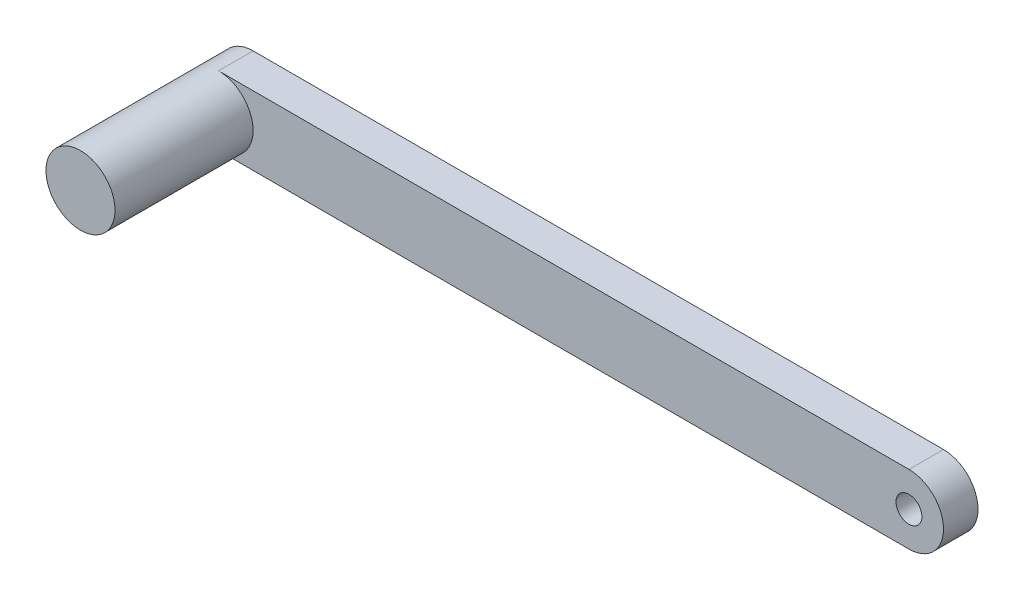
ISO-10303-21;
HEADER;
FILE_DESCRIPTION(('STEP AP214'),'2;1');
FILE_NAME('part.step','',(''),(''),'','','');
FILE_SCHEMA(('AUTOMOTIVE_DESIGN { 1 0 10303 214 1 1 1 1 }'));
ENDSEC;
DATA;
#1=APPLICATION_CONTEXT('core data for automotive mechanical design processes');
#2=APPLICATION_PROTOCOL_DEFINITION('international standard','automotive_design',2000,#1);
#3=PRODUCT_CONTEXT('',#1,'mechanical');
#4=PRODUCT('Part','Part','',(#3));
#5=PRODUCT_RELATED_PRODUCT_CATEGORY('part','',(#4));
#6=PRODUCT_DEFINITION_FORMATION('','',#4);
#7=PRODUCT_DEFINITION_CONTEXT('part definition',#1,'design');
#8=PRODUCT_DEFINITION('design','',#6,#7);
#9=PRODUCT_DEFINITION_SHAPE('','',#8);
#10=(LENGTH_UNIT() NAMED_UNIT(*) SI_UNIT(.MILLI.,.METRE.));
#11=(NAMED_UNIT(*) PLANE_ANGLE_UNIT() SI_UNIT($,.RADIAN.));
#12=(NAMED_UNIT(*) SI_UNIT($,.STERADIAN.) SOLID_ANGLE_UNIT());
#13=UNCERTAINTY_MEASURE_WITH_UNIT(LENGTH_MEASURE(1.E-05),#10,'distance_accuracy_value','');
#14=(GEOMETRIC_REPRESENTATION_CONTEXT(3) GLOBAL_UNCERTAINTY_ASSIGNED_CONTEXT((#13)) GLOBAL_UNIT_ASSIGNED_CONTEXT((#10,
#11,#12)) REPRESENTATION_CONTEXT('',''));
#15=CARTESIAN_POINT('',(0.,0.,0.));
#16=DIRECTION('',(0.,0.,1.));
#17=DIRECTION('',(1.,0.,0.));
#18=AXIS2_PLACEMENT_3D('',#15,#16,#17);
#19=CARTESIAN_POINT('',(0.,0.,2.));
#20=DIRECTION('',(0.,0.,-1.));
#21=DIRECTION('',(-1.,0.,0.));
#22=AXIS2_PLACEMENT_3D('',#19,#20,#21);
#23=CYLINDRICAL_SURFACE('',#22,2.);
#24=CARTESIAN_POINT('',(0.,0.,0.));
#25=DIRECTION('',(0.,0.,1.));
#26=DIRECTION('',(1.,0.,0.));
#27=AXIS2_PLACEMENT_3D('',#24,#25,#26);
#28=CIRCLE('',#27,2.);
#29=CARTESIAN_POINT('',(0.,2.,0.));
#30=VERTEX_POINT('',#29);
#31=CARTESIAN_POINT('',(0.,-2.,0.));
#32=VERTEX_POINT('',#31);
#33=EDGE_CURVE('E108',#30,#32,#28,.T.);
#34=ORIENTED_EDGE('',*,*,#33,.T.);
#35=DIRECTION('',(0.,0.,-1.));
#36=VECTOR('',#35,1.);
#37=CARTESIAN_POINT('',(0.,-2.,2.));
#38=LINE('',#37,#36);
#39=CARTESIAN_POINT('',(0.,-2.,2.));
#40=VERTEX_POINT('',#39);
#41=EDGE_CURVE('E55',#40,#32,#38,.T.);
#42=ORIENTED_EDGE('',*,*,#41,.F.);
#43=CARTESIAN_POINT('',(0.,0.,2.));
#44=DIRECTION('',(0.,0.,1.));
#45=DIRECTION('',(1.,0.,0.));
#46=AXIS2_PLACEMENT_3D('',#43,#44,#45);
#47=CIRCLE('',#46,2.);
#48=CARTESIAN_POINT('',(0.,2.,2.));
#49=VERTEX_POINT('',#48);
#50=EDGE_CURVE('E11',#40,#49,#47,.T.);
#51=ORIENTED_EDGE('',*,*,#50,.T.);
#52=DIRECTION('',(0.,0.,-1.));
#53=VECTOR('',#52,1.);
#54=CARTESIAN_POINT('',(0.,2.,2.));
#55=LINE('',#54,#53);
#56=EDGE_CURVE('E93',#49,#30,#55,.T.);
#57=ORIENTED_EDGE('',*,*,#56,.T.);
#58=EDGE_LOOP('',(#34,#42,#51,#57));
#59=FACE_BOUND('',#58,.T.);
#60=CARTESIAN_POINT('',(0.,0.,10.));
#61=DIRECTION('',(0.,0.,1.));
#62=DIRECTION('',(1.,0.,0.));
#63=AXIS2_PLACEMENT_3D('',#60,#61,#62);
#64=CIRCLE('',#63,2.);
#65=CARTESIAN_POINT('',(2.,0.,10.));
#66=VERTEX_POINT('',#65);
#67=EDGE_CURVE('E126',#66,#66,#64,.T.);
#68=ORIENTED_EDGE('',*,*,#67,.F.);
#69=EDGE_LOOP('',(#68));
#70=FACE_BOUND('',#69,.T.);
#71=ADVANCED_FACE('F45',(#59,#70),#23,.T.);
#72=CARTESIAN_POINT('',(0.,-2.,2.));
#73=DIRECTION('',(0.,1.,0.));
#74=DIRECTION('',(0.,0.,1.));
#75=AXIS2_PLACEMENT_3D('',#72,#73,#74);
#76=PLANE('',#75);
#77=DIRECTION('',(1.,0.,0.));
#78=VECTOR('',#77,1.);
#79=CARTESIAN_POINT('',(0.,-2.,0.));
#80=LINE('',#79,#78);
#81=CARTESIAN_POINT('',(40.,-2.,0.));
#82=VERTEX_POINT('',#81);
#83=EDGE_CURVE('E122',#32,#82,#80,.T.);
#84=ORIENTED_EDGE('',*,*,#83,.T.);
#85=DIRECTION('',(0.,0.,-1.));
#86=VECTOR('',#85,1.);
#87=CARTESIAN_POINT('',(40.,-2.,2.));
#88=LINE('',#87,#86);
#89=CARTESIAN_POINT('',(40.,-2.,2.));
#90=VERTEX_POINT('',#89);
#91=EDGE_CURVE('E111',#90,#82,#88,.T.);
#92=ORIENTED_EDGE('',*,*,#91,.F.);
#93=DIRECTION('',(1.,0.,0.));
#94=VECTOR('',#93,1.);
#95=CARTESIAN_POINT('',(0.,-2.,2.));
#96=LINE('',#95,#94);
#97=EDGE_CURVE('E119',#40,#90,#96,.T.);
#98=ORIENTED_EDGE('',*,*,#97,.F.);
#99=ORIENTED_EDGE('',*,*,#41,.T.);
#100=EDGE_LOOP('',(#84,#92,#98,#99));
#101=FACE_BOUND('',#100,.T.);
#102=ADVANCED_FACE('F158',(#101),#76,.F.);
#103=CARTESIAN_POINT('',(40.,0.,2.));
#104=DIRECTION('',(0.,0.,-1.));
#105=DIRECTION('',(-1.,0.,0.));
#106=AXIS2_PLACEMENT_3D('',#103,#104,#105);
#107=CYLINDRICAL_SURFACE('',#106,2.);
#108=CARTESIAN_POINT('',(40.,0.,0.));
#109=DIRECTION('',(0.,0.,1.));
#110=DIRECTION('',(1.,0.,0.));
#111=AXIS2_PLACEMENT_3D('',#108,#109,#110);
#112=CIRCLE('',#111,2.);
#113=CARTESIAN_POINT('',(40.,2.,0.));
#114=VERTEX_POINT('',#113);
#115=EDGE_CURVE('E81',#82,#114,#112,.T.);
#116=ORIENTED_EDGE('',*,*,#115,.T.);
#117=DIRECTION('',(0.,0.,-1.));
#118=VECTOR('',#117,1.);
#119=CARTESIAN_POINT('',(40.,2.,2.));
#120=LINE('',#119,#118);
#121=CARTESIAN_POINT('',(40.,2.,2.));
#122=VERTEX_POINT('',#121);
#123=EDGE_CURVE('E100',#122,#114,#120,.T.);
#124=ORIENTED_EDGE('',*,*,#123,.F.);
#125=CARTESIAN_POINT('',(40.,0.,2.));
#126=DIRECTION('',(0.,0.,1.));
#127=DIRECTION('',(1.,0.,0.));
#128=AXIS2_PLACEMENT_3D('',#125,#126,#127);
#129=CIRCLE('',#128,2.);
#130=EDGE_CURVE('E64',#90,#122,#129,.T.);
#131=ORIENTED_EDGE('',*,*,#130,.F.);
#132=ORIENTED_EDGE('',*,*,#91,.T.);
#133=EDGE_LOOP('',(#116,#124,#131,#132));
#134=FACE_BOUND('',#133,.T.);
#135=ADVANCED_FACE('F163',(#134),#107,.T.);
#136=CARTESIAN_POINT('',(0.,2.,2.));
#137=DIRECTION('',(0.,-1.,0.));
#138=DIRECTION('',(0.,0.,-1.));
#139=AXIS2_PLACEMENT_3D('',#136,#137,#138);
#140=PLANE('',#139);
#141=DIRECTION('',(-1.,0.,0.));
#142=VECTOR('',#141,1.);
#143=CARTESIAN_POINT('',(0.,2.,0.));
#144=LINE('',#143,#142);
#145=EDGE_CURVE('E87',#114,#30,#144,.T.);
#146=ORIENTED_EDGE('',*,*,#145,.T.);
#147=ORIENTED_EDGE('',*,*,#56,.F.);
#148=DIRECTION('',(-1.,0.,0.));
#149=VECTOR('',#148,1.);
#150=CARTESIAN_POINT('',(0.,2.,2.));
#151=LINE('',#150,#149);
#152=EDGE_CURVE('E95',#122,#49,#151,.T.);
#153=ORIENTED_EDGE('',*,*,#152,.F.);
#154=ORIENTED_EDGE('',*,*,#123,.T.);
#155=EDGE_LOOP('',(#146,#147,#153,#154));
#156=FACE_BOUND('',#155,.T.);
#157=ADVANCED_FACE('F94',(#156),#140,.F.);
#158=CARTESIAN_POINT('',(0.,0.,2.));
#159=DIRECTION('',(0.,0.,1.));
#160=DIRECTION('',(1.,0.,0.));
#161=AXIS2_PLACEMENT_3D('',#158,#159,#160);
#162=PLANE('',#161);
#163=CARTESIAN_POINT('',(40.,0.,2.));
#164=DIRECTION('',(0.,0.,1.));
#165=DIRECTION('',(1.,0.,0.));
#166=AXIS2_PLACEMENT_3D('',#163,#164,#165);
#167=CIRCLE('',#166,0.749999999999999);
#168=CARTESIAN_POINT('',(40.75,0.,2.));
#169=VERTEX_POINT('',#168);
#170=EDGE_CURVE('E135',#169,#169,#167,.T.);
#171=ORIENTED_EDGE('',*,*,#170,.F.);
#172=EDGE_LOOP('',(#171));
#173=FACE_BOUND('',#172,.T.);
#174=ORIENTED_EDGE('',*,*,#50,.F.);
#175=ORIENTED_EDGE('',*,*,#97,.T.);
#176=ORIENTED_EDGE('',*,*,#130,.T.);
#177=ORIENTED_EDGE('',*,*,#152,.T.);
#178=EDGE_LOOP('',(#174,#175,#176,#177));
#179=FACE_BOUND('',#178,.T.);
#180=ADVANCED_FACE('F102',(#173,#179),#162,.T.);
#181=CARTESIAN_POINT('',(0.,0.,0.));
#182=DIRECTION('',(0.,0.,1.));
#183=DIRECTION('',(1.,0.,0.));
#184=AXIS2_PLACEMENT_3D('',#181,#182,#183);
#185=PLANE('',#184);
#186=CARTESIAN_POINT('',(40.,0.,0.));
#187=DIRECTION('',(0.,0.,1.));
#188=DIRECTION('',(1.,0.,0.));
#189=AXIS2_PLACEMENT_3D('',#186,#187,#188);
#190=CIRCLE('',#189,0.749999999999999);
#191=CARTESIAN_POINT('',(40.75,0.,0.));
#192=VERTEX_POINT('',#191);
#193=EDGE_CURVE('E48',#192,#192,#190,.T.);
#194=ORIENTED_EDGE('',*,*,#193,.T.);
#195=EDGE_LOOP('',(#194));
#196=FACE_BOUND('',#195,.T.);
#197=ORIENTED_EDGE('',*,*,#33,.F.);
#198=ORIENTED_EDGE('',*,*,#145,.F.);
#199=ORIENTED_EDGE('',*,*,#115,.F.);
#200=ORIENTED_EDGE('',*,*,#83,.F.);
#201=EDGE_LOOP('',(#197,#198,#199,#200));
#202=FACE_BOUND('',#201,.T.);
#203=ADVANCED_FACE('F144',(#196,#202),#185,.F.);
#204=CARTESIAN_POINT('',(0.,0.,10.));
#205=DIRECTION('',(0.,0.,1.));
#206=DIRECTION('',(1.,0.,0.));
#207=AXIS2_PLACEMENT_3D('',#204,#205,#206);
#208=PLANE('',#207);
#209=ORIENTED_EDGE('',*,*,#67,.T.);
#210=EDGE_LOOP('',(#209));
#211=FACE_BOUND('',#210,.T.);
#212=ADVANCED_FACE('F149',(#211),#208,.T.);
#213=CARTESIAN_POINT('',(40.,0.,-8.));
#214=DIRECTION('',(0.,0.,1.));
#215=DIRECTION('',(1.,0.,0.));
#216=AXIS2_PLACEMENT_3D('',#213,#214,#215);
#217=CYLINDRICAL_SURFACE('',#216,0.749999999999999);
#218=ORIENTED_EDGE('',*,*,#170,.T.);
#219=EDGE_LOOP('',(#218));
#220=FACE_BOUND('',#219,.T.);
#221=ORIENTED_EDGE('',*,*,#193,.F.);
#222=EDGE_LOOP('',(#221));
#223=FACE_BOUND('',#222,.T.);
#224=ADVANCED_FACE('F147',(#220,#223),#217,.F.);
#225=CLOSED_SHELL('',(#71,#102,#135,#157,#180,#203,#212,#224));
#226=MANIFOLD_SOLID_BREP('B2',#225);
#227=ADVANCED_BREP_SHAPE_REPRESENTATION('',(#18,#226),#14);
#228=SHAPE_DEFINITION_REPRESENTATION(#9,#227);
ENDSEC;
END-ISO-10303-21;
